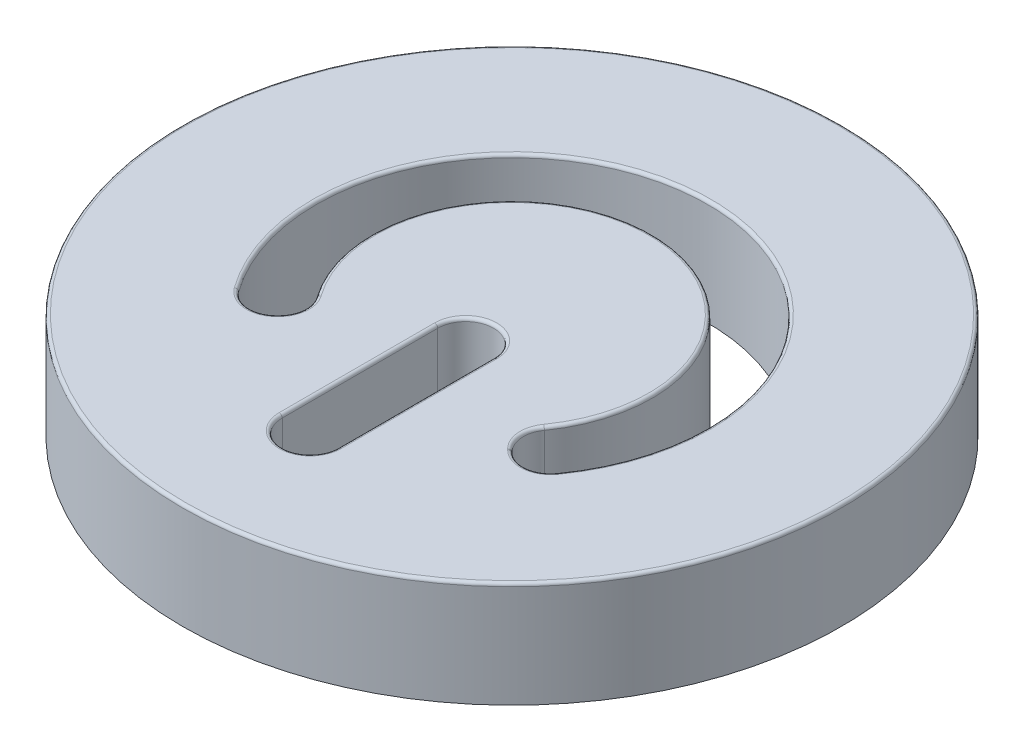
ISO-10303-21;
HEADER;
FILE_DESCRIPTION(('STEP AP214'),'2;1');
FILE_NAME('part.step','',(''),(''),'','','');
FILE_SCHEMA(('AUTOMOTIVE_DESIGN { 1 0 10303 214 1 1 1 1 }'));
ENDSEC;
DATA;
#1=APPLICATION_CONTEXT('core data for automotive mechanical design processes');
#2=APPLICATION_PROTOCOL_DEFINITION('international standard','automotive_design',2000,#1);
#3=PRODUCT_CONTEXT('',#1,'mechanical');
#4=PRODUCT('Part','Part','',(#3));
#5=PRODUCT_RELATED_PRODUCT_CATEGORY('part','',(#4));
#6=PRODUCT_DEFINITION_FORMATION('','',#4);
#7=PRODUCT_DEFINITION_CONTEXT('part definition',#1,'design');
#8=PRODUCT_DEFINITION('design','',#6,#7);
#9=PRODUCT_DEFINITION_SHAPE('','',#8);
#10=(LENGTH_UNIT() NAMED_UNIT(*) SI_UNIT(.MILLI.,.METRE.));
#11=(NAMED_UNIT(*) PLANE_ANGLE_UNIT() SI_UNIT($,.RADIAN.));
#12=(NAMED_UNIT(*) SI_UNIT($,.STERADIAN.) SOLID_ANGLE_UNIT());
#13=UNCERTAINTY_MEASURE_WITH_UNIT(LENGTH_MEASURE(1.E-05),#10,'distance_accuracy_value','');
#14=(GEOMETRIC_REPRESENTATION_CONTEXT(3) GLOBAL_UNCERTAINTY_ASSIGNED_CONTEXT((#13)) GLOBAL_UNIT_ASSIGNED_CONTEXT((#10,
#11,#12)) REPRESENTATION_CONTEXT('',''));
#15=CARTESIAN_POINT('',(0.,0.,0.));
#16=DIRECTION('',(0.,0.,1.));
#17=DIRECTION('',(1.,0.,0.));
#18=AXIS2_PLACEMENT_3D('',#15,#16,#17);
#19=CARTESIAN_POINT('',(2.20196013342093,1.65,1.57970616597673));
#20=DIRECTION('',(0.,1.,0.));
#21=DIRECTION('',(0.,0.,1.));
#22=AXIS2_PLACEMENT_3D('',#19,#20,#21);
#23=TOROIDAL_SURFACE('',#22,0.490000000000001,0.05);
#24=CARTESIAN_POINT('',(2.20196013342093,1.7,1.57970616597673));
#25=DIRECTION('',(0.,-1.,0.));
#26=DIRECTION('',(0.,0.,1.));
#27=AXIS2_PLACEMENT_3D('',#24,#25,#26);
#28=CIRCLE('',#27,0.490000000000001);
#29=CARTESIAN_POINT('',(2.6001005265487,1.7,1.86533569414227));
#30=VERTEX_POINT('',#29);
#31=CARTESIAN_POINT('',(1.85547781063952,1.7,1.92618848875814));
#32=VERTEX_POINT('',#31);
#33=EDGE_CURVE('E316',#30,#32,#28,.T.);
#34=ORIENTED_EDGE('',*,*,#33,.F.);
#35=CARTESIAN_POINT('',(2.6001005265487,1.65,1.86533569414227));
#36=DIRECTION('',(-0.582917404419459,0.,0.812531414546466));
#37=DIRECTION('',(0.812531414546466,0.,0.582917404419459));
#38=AXIS2_PLACEMENT_3D('',#35,#36,#37);
#39=CIRCLE('',#38,0.0499999999999999);
#40=CARTESIAN_POINT('',(2.55947395582137,1.65,1.83618982392129));
#41=VERTEX_POINT('',#40);
#42=EDGE_CURVE('E177',#30,#41,#39,.T.);
#43=ORIENTED_EDGE('',*,*,#42,.T.);
#44=CARTESIAN_POINT('',(2.20196013342093,1.65,1.57970616597673));
#45=DIRECTION('',(0.,1.,0.));
#46=DIRECTION('',(0.,0.,1.));
#47=AXIS2_PLACEMENT_3D('',#44,#45,#46);
#48=CIRCLE('',#47,0.440000000000001);
#49=CARTESIAN_POINT('',(1.89083314969885,1.65,1.89083314969881));
#50=VERTEX_POINT('',#49);
#51=EDGE_CURVE('E333',#50,#41,#48,.T.);
#52=ORIENTED_EDGE('',*,*,#51,.F.);
#53=CARTESIAN_POINT('',(1.85547781063952,1.65,1.92618848875814));
#54=DIRECTION('',(-0.707106781186552,0.,-0.707106781186543));
#55=DIRECTION('',(-0.707106781186543,0.,0.707106781186552));
#56=AXIS2_PLACEMENT_3D('',#53,#54,#55);
#57=CIRCLE('',#56,0.0500000000000001);
#58=EDGE_CURVE('E36',#32,#50,#57,.T.);
#59=ORIENTED_EDGE('',*,*,#58,.F.);
#60=EDGE_LOOP('',(#34,#43,#52,#59));
#61=FACE_BOUND('',#60,.T.);
#62=ADVANCED_FACE('F17',(#61),#23,.T.);
#63=CARTESIAN_POINT('',(-2.2019601334209,1.65,1.57970616597677));
#64=DIRECTION('',(0.,1.,0.));
#65=DIRECTION('',(0.,0.,1.));
#66=AXIS2_PLACEMENT_3D('',#63,#64,#65);
#67=TOROIDAL_SURFACE('',#66,0.49,0.05);
#68=CARTESIAN_POINT('',(-2.2019601334209,1.7,1.57970616597677));
#69=DIRECTION('',(0.,-1.,0.));
#70=DIRECTION('',(0.,0.,1.));
#71=AXIS2_PLACEMENT_3D('',#68,#69,#70);
#72=CIRCLE('',#71,0.49);
#73=CARTESIAN_POINT('',(-1.85547781063949,1.7,1.92618848875817));
#74=VERTEX_POINT('',#73);
#75=CARTESIAN_POINT('',(-2.60010052654866,1.7,1.86533569414231));
#76=VERTEX_POINT('',#75);
#77=EDGE_CURVE('E312',#74,#76,#72,.T.);
#78=ORIENTED_EDGE('',*,*,#77,.F.);
#79=CARTESIAN_POINT('',(-1.85547781063949,1.65,1.92618848875817));
#80=DIRECTION('',(0.707106781186541,0.,-0.707106781186554));
#81=DIRECTION('',(-0.707106781186554,0.,-0.707106781186541));
#82=AXIS2_PLACEMENT_3D('',#79,#80,#81);
#83=CIRCLE('',#82,0.0499999999999999);
#84=CARTESIAN_POINT('',(-1.89083314969881,1.65,1.89083314969885));
#85=VERTEX_POINT('',#84);
#86=EDGE_CURVE('E181',#85,#74,#83,.T.);
#87=ORIENTED_EDGE('',*,*,#86,.F.);
#88=CARTESIAN_POINT('',(-2.2019601334209,1.65,1.57970616597677));
#89=DIRECTION('',(0.,1.,0.));
#90=DIRECTION('',(0.,0.,1.));
#91=AXIS2_PLACEMENT_3D('',#88,#89,#90);
#92=CIRCLE('',#91,0.44);
#93=CARTESIAN_POINT('',(-2.55947395582134,1.65,1.83618982392134));
#94=VERTEX_POINT('',#93);
#95=EDGE_CURVE('E271',#94,#85,#92,.T.);
#96=ORIENTED_EDGE('',*,*,#95,.F.);
#97=CARTESIAN_POINT('',(-2.60010052654866,1.65,1.86533569414231));
#98=DIRECTION('',(0.582917404419472,0.,0.812531414546457));
#99=DIRECTION('',(0.812531414546457,0.,-0.582917404419472));
#100=AXIS2_PLACEMENT_3D('',#97,#98,#99);
#101=CIRCLE('',#100,0.05);
#102=EDGE_CURVE('E11',#94,#76,#101,.T.);
#103=ORIENTED_EDGE('',*,*,#102,.T.);
#104=EDGE_LOOP('',(#78,#87,#96,#103));
#105=FACE_BOUND('',#104,.T.);
#106=ADVANCED_FACE('F372',(#105),#67,.T.);
#107=CARTESIAN_POINT('',(0.,1.65,0.));
#108=DIRECTION('',(0.,1.,0.));
#109=DIRECTION('',(0.,0.,1.));
#110=AXIS2_PLACEMENT_3D('',#107,#108,#109);
#111=TOROIDAL_SURFACE('',#110,5.25,0.05);
#112=CARTESIAN_POINT('',(0.,1.7,0.));
#113=DIRECTION('',(0.,1.,0.));
#114=DIRECTION('',(0.,0.,1.));
#115=AXIS2_PLACEMENT_3D('',#112,#113,#114);
#116=CIRCLE('',#115,5.25);
#117=CARTESIAN_POINT('',(0.,1.7,5.25));
#118=VERTEX_POINT('',#117);
#119=EDGE_CURVE('E303',#118,#118,#116,.T.);
#120=ORIENTED_EDGE('',*,*,#119,.F.);
#121=EDGE_LOOP('',(#120));
#122=FACE_BOUND('',#121,.T.);
#123=CARTESIAN_POINT('',(0.,1.65,0.));
#124=DIRECTION('',(0.,-1.,0.));
#125=DIRECTION('',(0.,0.,1.));
#126=AXIS2_PLACEMENT_3D('',#123,#124,#125);
#127=CIRCLE('',#126,5.3);
#128=CARTESIAN_POINT('',(0.,1.65,5.3));
#129=VERTEX_POINT('',#128);
#130=EDGE_CURVE('E252',#129,#129,#127,.T.);
#131=ORIENTED_EDGE('',*,*,#130,.F.);
#132=EDGE_LOOP('',(#131));
#133=FACE_BOUND('',#132,.T.);
#134=ADVANCED_FACE('F378',(#122,#133),#111,.T.);
#135=CARTESIAN_POINT('',(0.,1.65,3.24458348950111));
#136=DIRECTION('',(0.,1.,0.));
#137=DIRECTION('',(0.,0.,1.));
#138=AXIS2_PLACEMENT_3D('',#135,#136,#137);
#139=TOROIDAL_SURFACE('',#138,0.5,0.05);
#140=CARTESIAN_POINT('',(0.,1.7,3.24458348950111));
#141=DIRECTION('',(0.,-1.,0.));
#142=DIRECTION('',(0.,0.,1.));
#143=AXIS2_PLACEMENT_3D('',#140,#141,#142);
#144=CIRCLE('',#143,0.5);
#145=CARTESIAN_POINT('',(0.5,1.7,3.24458348950111));
#146=VERTEX_POINT('',#145);
#147=CARTESIAN_POINT('',(-0.5,1.7,3.24458348950111));
#148=VERTEX_POINT('',#147);
#149=EDGE_CURVE('E301',#146,#148,#144,.T.);
#150=ORIENTED_EDGE('',*,*,#149,.F.);
#151=CARTESIAN_POINT('',(0.5,1.65,3.24458348950111));
#152=DIRECTION('',(0.,0.,-1.));
#153=DIRECTION('',(-1.,0.,0.));
#154=AXIS2_PLACEMENT_3D('',#151,#152,#153);
#155=CIRCLE('',#154,0.05);
#156=CARTESIAN_POINT('',(0.45,1.65,3.24458348950111));
#157=VERTEX_POINT('',#156);
#158=EDGE_CURVE('E176',#157,#146,#155,.T.);
#159=ORIENTED_EDGE('',*,*,#158,.F.);
#160=CARTESIAN_POINT('',(0.,1.65,3.24458348950111));
#161=DIRECTION('',(0.,1.,0.));
#162=DIRECTION('',(0.,0.,1.));
#163=AXIS2_PLACEMENT_3D('',#160,#161,#162);
#164=CIRCLE('',#163,0.45);
#165=CARTESIAN_POINT('',(-0.45,1.65,3.24458348950111));
#166=VERTEX_POINT('',#165);
#167=EDGE_CURVE('E233',#166,#157,#164,.T.);
#168=ORIENTED_EDGE('',*,*,#167,.F.);
#169=CARTESIAN_POINT('',(-0.5,1.65,3.24458348950111));
#170=DIRECTION('',(0.,0.,1.));
#171=DIRECTION('',(1.,0.,0.));
#172=AXIS2_PLACEMENT_3D('',#169,#170,#171);
#173=CIRCLE('',#172,0.05);
#174=EDGE_CURVE('E27',#166,#148,#173,.T.);
#175=ORIENTED_EDGE('',*,*,#174,.T.);
#176=EDGE_LOOP('',(#150,#159,#168,#175));
#177=FACE_BOUND('',#176,.T.);
#178=ADVANCED_FACE('F350',(#177),#139,.T.);
#179=CARTESIAN_POINT('',(0.,0.,3.24458348950111));
#180=DIRECTION('',(0.,1.,0.));
#181=DIRECTION('',(0.,0.,1.));
#182=AXIS2_PLACEMENT_3D('',#179,#180,#181);
#183=CYLINDRICAL_SURFACE('',#182,0.45);
#184=CARTESIAN_POINT('',(0.,0.,3.24458348950111));
#185=DIRECTION('',(0.,1.,0.));
#186=DIRECTION('',(0.,0.,1.));
#187=AXIS2_PLACEMENT_3D('',#184,#185,#186);
#188=CIRCLE('',#187,0.45);
#189=CARTESIAN_POINT('',(-0.45,0.,3.24458348950111));
#190=VERTEX_POINT('',#189);
#191=CARTESIAN_POINT('',(0.45,0.,3.24458348950111));
#192=VERTEX_POINT('',#191);
#193=EDGE_CURVE('E257',#190,#192,#188,.T.);
#194=ORIENTED_EDGE('',*,*,#193,.F.);
#195=DIRECTION('',(0.,1.,0.));
#196=VECTOR('',#195,1.);
#197=CARTESIAN_POINT('',(-0.45,0.,3.24458348950111));
#198=LINE('',#197,#196);
#199=EDGE_CURVE('E230',#190,#166,#198,.T.);
#200=ORIENTED_EDGE('',*,*,#199,.T.);
#201=ORIENTED_EDGE('',*,*,#167,.T.);
#202=DIRECTION('',(0.,1.,0.));
#203=VECTOR('',#202,1.);
#204=CARTESIAN_POINT('',(0.45,0.,3.24458348950111));
#205=LINE('',#204,#203);
#206=EDGE_CURVE('E152',#192,#157,#205,.T.);
#207=ORIENTED_EDGE('',*,*,#206,.F.);
#208=EDGE_LOOP('',(#194,#200,#201,#207));
#209=FACE_BOUND('',#208,.T.);
#210=ADVANCED_FACE('F352',(#209),#183,.F.);
#211=CARTESIAN_POINT('',(2.20196013342093,0.,1.57970616597673));
#212=DIRECTION('',(0.,1.,0.));
#213=DIRECTION('',(0.,0.,1.));
#214=AXIS2_PLACEMENT_3D('',#211,#212,#213);
#215=CYLINDRICAL_SURFACE('',#214,0.440000000000001);
#216=CARTESIAN_POINT('',(2.20196013342093,0.,1.57970616597673));
#217=DIRECTION('',(0.,1.,0.));
#218=DIRECTION('',(0.,0.,1.));
#219=AXIS2_PLACEMENT_3D('',#216,#217,#218);
#220=CIRCLE('',#219,0.440000000000001);
#221=CARTESIAN_POINT('',(1.89083314969885,0.,1.89083314969881));
#222=VERTEX_POINT('',#221);
#223=CARTESIAN_POINT('',(2.55947395582137,0.,1.83618982392129));
#224=VERTEX_POINT('',#223);
#225=EDGE_CURVE('E263',#222,#224,#220,.T.);
#226=ORIENTED_EDGE('',*,*,#225,.F.);
#227=DIRECTION('',(0.,1.,0.));
#228=VECTOR('',#227,1.);
#229=CARTESIAN_POINT('',(1.89083314969885,0.,1.89083314969881));
#230=LINE('',#229,#228);
#231=EDGE_CURVE('E331',#222,#50,#230,.T.);
#232=ORIENTED_EDGE('',*,*,#231,.T.);
#233=ORIENTED_EDGE('',*,*,#51,.T.);
#234=DIRECTION('',(0.,1.,0.));
#235=VECTOR('',#234,1.);
#236=CARTESIAN_POINT('',(2.55947395582137,0.,1.83618982392129));
#237=LINE('',#236,#235);
#238=EDGE_CURVE('E268',#224,#41,#237,.T.);
#239=ORIENTED_EDGE('',*,*,#238,.F.);
#240=EDGE_LOOP('',(#226,#232,#233,#239));
#241=FACE_BOUND('',#240,.T.);
#242=ADVANCED_FACE('F389',(#241),#215,.F.);
#243=CARTESIAN_POINT('',(-2.2019601334209,0.,1.57970616597677));
#244=DIRECTION('',(0.,1.,0.));
#245=DIRECTION('',(0.,0.,1.));
#246=AXIS2_PLACEMENT_3D('',#243,#244,#245);
#247=CYLINDRICAL_SURFACE('',#246,0.44);
#248=CARTESIAN_POINT('',(-2.2019601334209,0.,1.57970616597677));
#249=DIRECTION('',(0.,1.,0.));
#250=DIRECTION('',(0.,0.,1.));
#251=AXIS2_PLACEMENT_3D('',#248,#249,#250);
#252=CIRCLE('',#251,0.44);
#253=CARTESIAN_POINT('',(-2.55947395582134,0.,1.83618982392134));
#254=VERTEX_POINT('',#253);
#255=CARTESIAN_POINT('',(-1.89083314969881,0.,1.89083314969885));
#256=VERTEX_POINT('',#255);
#257=EDGE_CURVE('E273',#254,#256,#252,.T.);
#258=ORIENTED_EDGE('',*,*,#257,.F.);
#259=DIRECTION('',(0.,1.,0.));
#260=VECTOR('',#259,1.);
#261=CARTESIAN_POINT('',(-2.55947395582134,0.,1.83618982392134));
#262=LINE('',#261,#260);
#263=EDGE_CURVE('E326',#254,#94,#262,.T.);
#264=ORIENTED_EDGE('',*,*,#263,.T.);
#265=ORIENTED_EDGE('',*,*,#95,.T.);
#266=DIRECTION('',(0.,1.,0.));
#267=VECTOR('',#266,1.);
#268=CARTESIAN_POINT('',(-1.89083314969881,0.,1.89083314969885));
#269=LINE('',#268,#267);
#270=EDGE_CURVE('E276',#256,#85,#269,.T.);
#271=ORIENTED_EDGE('',*,*,#270,.F.);
#272=EDGE_LOOP('',(#258,#264,#265,#271));
#273=FACE_BOUND('',#272,.T.);
#274=ADVANCED_FACE('F366',(#273),#247,.F.);
#275=CARTESIAN_POINT('',(0.,0.,0.));
#276=DIRECTION('',(0.,1.,0.));
#277=DIRECTION('',(0.,0.,1.));
#278=AXIS2_PLACEMENT_3D('',#275,#276,#277);
#279=CYLINDRICAL_SURFACE('',#278,5.3);
#280=ORIENTED_EDGE('',*,*,#130,.T.);
#281=EDGE_LOOP('',(#280));
#282=FACE_BOUND('',#281,.T.);
#283=CARTESIAN_POINT('',(0.,0.,0.));
#284=DIRECTION('',(0.,1.,0.));
#285=DIRECTION('',(0.,0.,1.));
#286=AXIS2_PLACEMENT_3D('',#283,#284,#285);
#287=CIRCLE('',#286,5.3);
#288=CARTESIAN_POINT('',(0.,0.,5.3));
#289=VERTEX_POINT('',#288);
#290=EDGE_CURVE('E249',#289,#289,#287,.T.);
#291=ORIENTED_EDGE('',*,*,#290,.T.);
#292=EDGE_LOOP('',(#291));
#293=FACE_BOUND('',#292,.T.);
#294=ADVANCED_FACE('F356',(#282,#293),#279,.T.);
#295=CARTESIAN_POINT('',(0.,0.,0.));
#296=DIRECTION('',(0.,1.,0.));
#297=DIRECTION('',(0.,0.,1.));
#298=AXIS2_PLACEMENT_3D('',#295,#296,#297);
#299=PLANE('',#298);
#300=ORIENTED_EDGE('',*,*,#290,.F.);
#301=EDGE_LOOP('',(#300));
#302=FACE_BOUND('',#301,.T.);
#303=DIRECTION('',(0.707106781186542,0.,-0.707106781186553));
#304=VECTOR('',#303,1.);
#305=CARTESIAN_POINT('',(-1.8764994004795,0.,1.87649940047954));
#306=LINE('',#305,#304);
#307=CARTESIAN_POINT('',(-1.8764994004795,0.,1.87649940047954));
#308=VERTEX_POINT('',#307);
#309=EDGE_CURVE('E281',#256,#308,#306,.T.);
#310=ORIENTED_EDGE('',*,*,#309,.T.);
#311=CARTESIAN_POINT('',(-2.18762638420159,0.,1.56537241675746));
#312=DIRECTION('',(0.,1.,0.));
#313=DIRECTION('',(0.,0.,1.));
#314=AXIS2_PLACEMENT_3D('',#311,#312,#313);
#315=CIRCLE('',#314,0.44);
#316=CARTESIAN_POINT('',(-1.82979902024296,0.,1.30932637089378));
#317=VERTEX_POINT('',#316);
#318=EDGE_CURVE('E284',#308,#317,#315,.T.);
#319=ORIENTED_EDGE('',*,*,#318,.T.);
#320=CARTESIAN_POINT('',(0.,0.,0.));
#321=DIRECTION('',(0.,-1.,0.));
#322=DIRECTION('',(0.,0.,1.));
#323=AXIS2_PLACEMENT_3D('',#320,#321,#322);
#324=CIRCLE('',#323,2.25);
#325=CARTESIAN_POINT('',(1.82979902024299,0.,1.30932637089375));
#326=VERTEX_POINT('',#325);
#327=EDGE_CURVE('E287',#317,#326,#324,.T.);
#328=ORIENTED_EDGE('',*,*,#327,.T.);
#329=CARTESIAN_POINT('',(2.18762638420161,0.,1.56537241675742));
#330=DIRECTION('',(0.,1.,0.));
#331=DIRECTION('',(0.,0.,-1.));
#332=AXIS2_PLACEMENT_3D('',#329,#330,#331);
#333=CIRCLE('',#332,0.44);
#334=CARTESIAN_POINT('',(1.87649940047954,0.,1.8764994004795));
#335=VERTEX_POINT('',#334);
#336=EDGE_CURVE('E219',#326,#335,#333,.T.);
#337=ORIENTED_EDGE('',*,*,#336,.T.);
#338=DIRECTION('',(0.707106781186553,0.,0.707106781186542));
#339=VECTOR('',#338,1.);
#340=CARTESIAN_POINT('',(1.87649940047954,0.,1.8764994004795));
#341=LINE('',#340,#339);
#342=EDGE_CURVE('E266',#335,#222,#341,.T.);
#343=ORIENTED_EDGE('',*,*,#342,.T.);
#344=ORIENTED_EDGE('',*,*,#225,.T.);
#345=CARTESIAN_POINT('',(0.,0.,0.));
#346=DIRECTION('',(0.,1.,0.));
#347=DIRECTION('',(0.,0.,1.));
#348=AXIS2_PLACEMENT_3D('',#345,#346,#347);
#349=CIRCLE('',#348,3.15);
#350=EDGE_CURVE('E267',#224,#254,#349,.T.);
#351=ORIENTED_EDGE('',*,*,#350,.T.);
#352=ORIENTED_EDGE('',*,*,#257,.T.);
#353=EDGE_LOOP('',(#310,#319,#328,#337,#343,#344,#351,#352));
#354=FACE_BOUND('',#353,.T.);
#355=DIRECTION('',(0.,0.,1.));
#356=VECTOR('',#355,1.);
#357=CARTESIAN_POINT('',(-0.45,0.,3.24458348950111));
#358=LINE('',#357,#356);
#359=CARTESIAN_POINT('',(-0.45,0.,0.744583489501109));
#360=VERTEX_POINT('',#359);
#361=EDGE_CURVE('E260',#360,#190,#358,.T.);
#362=ORIENTED_EDGE('',*,*,#361,.T.);
#363=ORIENTED_EDGE('',*,*,#193,.T.);
#364=DIRECTION('',(0.,0.,-1.));
#365=VECTOR('',#364,1.);
#366=CARTESIAN_POINT('',(0.45,0.,3.24458348950111));
#367=LINE('',#366,#365);
#368=CARTESIAN_POINT('',(0.45,0.,0.744583489501109));
#369=VERTEX_POINT('',#368);
#370=EDGE_CURVE('E261',#192,#369,#367,.T.);
#371=ORIENTED_EDGE('',*,*,#370,.T.);
#372=CARTESIAN_POINT('',(0.,0.,0.744583489501109));
#373=DIRECTION('',(0.,1.,0.));
#374=DIRECTION('',(0.,0.,1.));
#375=AXIS2_PLACEMENT_3D('',#372,#373,#374);
#376=CIRCLE('',#375,0.45);
#377=EDGE_CURVE('E168',#369,#360,#376,.T.);
#378=ORIENTED_EDGE('',*,*,#377,.T.);
#379=EDGE_LOOP('',(#362,#363,#371,#378));
#380=FACE_BOUND('',#379,.T.);
#381=ADVANCED_FACE('F354',(#302,#354,#380),#299,.F.);
#382=CARTESIAN_POINT('',(0.,1.7,0.));
#383=DIRECTION('',(0.,1.,0.));
#384=DIRECTION('',(0.,0.,1.));
#385=AXIS2_PLACEMENT_3D('',#382,#383,#384);
#386=PLANE('',#385);
#387=CARTESIAN_POINT('',(0.,1.7,0.744583489501109));
#388=DIRECTION('',(0.,-1.,0.));
#389=DIRECTION('',(0.,0.,1.));
#390=AXIS2_PLACEMENT_3D('',#387,#388,#389);
#391=CIRCLE('',#390,0.5);
#392=CARTESIAN_POINT('',(-0.5,1.7,0.744583489501109));
#393=VERTEX_POINT('',#392);
#394=CARTESIAN_POINT('',(0.5,1.7,0.744583489501109));
#395=VERTEX_POINT('',#394);
#396=EDGE_CURVE('E298',#393,#395,#391,.T.);
#397=ORIENTED_EDGE('',*,*,#396,.T.);
#398=DIRECTION('',(0.,0.,1.));
#399=VECTOR('',#398,1.);
#400=CARTESIAN_POINT('',(0.5,1.7,3.24458348950111));
#401=LINE('',#400,#399);
#402=EDGE_CURVE('E174',#395,#146,#401,.T.);
#403=ORIENTED_EDGE('',*,*,#402,.T.);
#404=ORIENTED_EDGE('',*,*,#149,.T.);
#405=DIRECTION('',(0.,0.,-1.));
#406=VECTOR('',#405,1.);
#407=CARTESIAN_POINT('',(-0.5,1.7,0.744583489501109));
#408=LINE('',#407,#406);
#409=EDGE_CURVE('E247',#148,#393,#408,.T.);
#410=ORIENTED_EDGE('',*,*,#409,.T.);
#411=EDGE_LOOP('',(#397,#403,#404,#410));
#412=FACE_BOUND('',#411,.T.);
#413=ORIENTED_EDGE('',*,*,#119,.T.);
#414=EDGE_LOOP('',(#413));
#415=FACE_BOUND('',#414,.T.);
#416=CARTESIAN_POINT('',(2.18762638420161,1.7,1.56537241675742));
#417=DIRECTION('',(0.,-1.,0.));
#418=DIRECTION('',(0.,0.,1.));
#419=AXIS2_PLACEMENT_3D('',#416,#417,#418);
#420=CIRCLE('',#419,0.49);
#421=CARTESIAN_POINT('',(1.84114406142021,1.7,1.91185473953883));
#422=VERTEX_POINT('',#421);
#423=CARTESIAN_POINT('',(1.78913681979314,1.7,1.28023022931834));
#424=VERTEX_POINT('',#423);
#425=EDGE_CURVE('E207',#422,#424,#420,.T.);
#426=ORIENTED_EDGE('',*,*,#425,.T.);
#427=CARTESIAN_POINT('',(0.,1.7,0.));
#428=DIRECTION('',(0.,1.,0.));
#429=DIRECTION('',(0.,0.,1.));
#430=AXIS2_PLACEMENT_3D('',#427,#428,#429);
#431=CIRCLE('',#430,2.2);
#432=CARTESIAN_POINT('',(-1.78913681979312,1.7,1.28023022931837));
#433=VERTEX_POINT('',#432);
#434=EDGE_CURVE('E201',#424,#433,#431,.T.);
#435=ORIENTED_EDGE('',*,*,#434,.T.);
#436=CARTESIAN_POINT('',(-2.18762638420159,1.7,1.56537241675746));
#437=DIRECTION('',(0.,-1.,0.));
#438=DIRECTION('',(0.,0.,1.));
#439=AXIS2_PLACEMENT_3D('',#436,#437,#438);
#440=CIRCLE('',#439,0.49);
#441=CARTESIAN_POINT('',(-1.84114406142018,1.7,1.91185473953886));
#442=VERTEX_POINT('',#441);
#443=EDGE_CURVE('E306',#433,#442,#440,.T.);
#444=ORIENTED_EDGE('',*,*,#443,.T.);
#445=DIRECTION('',(-0.707106781186542,0.,0.707106781186553));
#446=VECTOR('',#445,1.);
#447=CARTESIAN_POINT('',(-1.85547781063949,1.7,1.92618848875817));
#448=LINE('',#447,#446);
#449=EDGE_CURVE('E309',#442,#74,#448,.T.);
#450=ORIENTED_EDGE('',*,*,#449,.T.);
#451=ORIENTED_EDGE('',*,*,#77,.T.);
#452=CARTESIAN_POINT('',(0.,1.7,0.));
#453=DIRECTION('',(0.,-1.,0.));
#454=DIRECTION('',(0.,0.,1.));
#455=AXIS2_PLACEMENT_3D('',#452,#453,#454);
#456=CIRCLE('',#455,3.2);
#457=EDGE_CURVE('E313',#76,#30,#456,.T.);
#458=ORIENTED_EDGE('',*,*,#457,.T.);
#459=ORIENTED_EDGE('',*,*,#33,.T.);
#460=DIRECTION('',(-0.707106781186553,0.,-0.707106781186542));
#461=VECTOR('',#460,1.);
#462=CARTESIAN_POINT('',(1.84114406142021,1.7,1.91185473953883));
#463=LINE('',#462,#461);
#464=EDGE_CURVE('E317',#32,#422,#463,.T.);
#465=ORIENTED_EDGE('',*,*,#464,.T.);
#466=EDGE_LOOP('',(#426,#435,#444,#450,#451,#458,#459,#465));
#467=FACE_BOUND('',#466,.T.);
#468=ADVANCED_FACE('F348',(#412,#415,#467),#386,.T.);
#469=CARTESIAN_POINT('',(-2.18762638420159,0.,1.56537241675746));
#470=DIRECTION('',(0.,1.,0.));
#471=DIRECTION('',(0.,0.,1.));
#472=AXIS2_PLACEMENT_3D('',#469,#470,#471);
#473=CYLINDRICAL_SURFACE('',#472,0.44);
#474=DIRECTION('',(0.,1.,0.));
#475=VECTOR('',#474,1.);
#476=CARTESIAN_POINT('',(-1.8764994004795,0.,1.87649940047954));
#477=LINE('',#476,#475);
#478=CARTESIAN_POINT('',(-1.8764994004795,1.65,1.87649940047954));
#479=VERTEX_POINT('',#478);
#480=EDGE_CURVE('E319',#308,#479,#477,.T.);
#481=ORIENTED_EDGE('',*,*,#480,.T.);
#482=CARTESIAN_POINT('',(-2.18762638420159,1.65,1.56537241675746));
#483=DIRECTION('',(0.,1.,0.));
#484=DIRECTION('',(0.,0.,1.));
#485=AXIS2_PLACEMENT_3D('',#482,#483,#484);
#486=CIRCLE('',#485,0.44);
#487=CARTESIAN_POINT('',(-1.82979902024296,1.65,1.30932637089378));
#488=VERTEX_POINT('',#487);
#489=EDGE_CURVE('E278',#479,#488,#486,.T.);
#490=ORIENTED_EDGE('',*,*,#489,.T.);
#491=DIRECTION('',(0.,1.,0.));
#492=VECTOR('',#491,1.);
#493=CARTESIAN_POINT('',(-1.82979902024296,0.,1.30932637089378));
#494=LINE('',#493,#492);
#495=EDGE_CURVE('E214',#317,#488,#494,.T.);
#496=ORIENTED_EDGE('',*,*,#495,.F.);
#497=ORIENTED_EDGE('',*,*,#318,.F.);
#498=EDGE_LOOP('',(#481,#490,#496,#497));
#499=FACE_BOUND('',#498,.T.);
#500=ADVANCED_FACE('F364',(#499),#473,.F.);
#501=CARTESIAN_POINT('',(-1.8764994004795,0.,1.87649940047954));
#502=DIRECTION('',(0.707106781186553,0.,0.707106781186542));
#503=DIRECTION('',(0.707106781186542,0.,-0.707106781186553));
#504=AXIS2_PLACEMENT_3D('',#501,#502,#503);
#505=PLANE('',#504);
#506=ORIENTED_EDGE('',*,*,#270,.T.);
#507=DIRECTION('',(0.707106781186542,0.,-0.707106781186553));
#508=VECTOR('',#507,1.);
#509=CARTESIAN_POINT('',(-1.8764994004795,1.65,1.87649940047954));
#510=LINE('',#509,#508);
#511=EDGE_CURVE('E279',#85,#479,#510,.T.);
#512=ORIENTED_EDGE('',*,*,#511,.T.);
#513=ORIENTED_EDGE('',*,*,#480,.F.);
#514=ORIENTED_EDGE('',*,*,#309,.F.);
#515=EDGE_LOOP('',(#506,#512,#513,#514));
#516=FACE_BOUND('',#515,.T.);
#517=ADVANCED_FACE('F414',(#516),#505,.F.);
#518=CARTESIAN_POINT('',(0.,0.,0.));
#519=DIRECTION('',(0.,1.,0.));
#520=DIRECTION('',(0.,0.,1.));
#521=AXIS2_PLACEMENT_3D('',#518,#519,#520);
#522=CYLINDRICAL_SURFACE('',#521,3.15);
#523=ORIENTED_EDGE('',*,*,#238,.T.);
#524=CARTESIAN_POINT('',(0.,1.65,0.));
#525=DIRECTION('',(0.,1.,0.));
#526=DIRECTION('',(0.,0.,1.));
#527=AXIS2_PLACEMENT_3D('',#524,#525,#526);
#528=CIRCLE('',#527,3.15);
#529=EDGE_CURVE('E272',#41,#94,#528,.T.);
#530=ORIENTED_EDGE('',*,*,#529,.T.);
#531=ORIENTED_EDGE('',*,*,#263,.F.);
#532=ORIENTED_EDGE('',*,*,#350,.F.);
#533=EDGE_LOOP('',(#523,#530,#531,#532));
#534=FACE_BOUND('',#533,.T.);
#535=ADVANCED_FACE('F401',(#534),#522,.F.);
#536=CARTESIAN_POINT('',(1.87649940047954,0.,1.8764994004795));
#537=DIRECTION('',(-0.707106781186542,0.,0.707106781186553));
#538=DIRECTION('',(0.707106781186553,0.,0.707106781186542));
#539=AXIS2_PLACEMENT_3D('',#536,#537,#538);
#540=PLANE('',#539);
#541=DIRECTION('',(0.,1.,0.));
#542=VECTOR('',#541,1.);
#543=CARTESIAN_POINT('',(1.87649940047954,0.,1.8764994004795));
#544=LINE('',#543,#542);
#545=CARTESIAN_POINT('',(1.87649940047954,1.65,1.8764994004795));
#546=VERTEX_POINT('',#545);
#547=EDGE_CURVE('E225',#335,#546,#544,.T.);
#548=ORIENTED_EDGE('',*,*,#547,.T.);
#549=DIRECTION('',(0.707106781186553,0.,0.707106781186542));
#550=VECTOR('',#549,1.);
#551=CARTESIAN_POINT('',(1.89083314969885,1.65,1.89083314969881));
#552=LINE('',#551,#550);
#553=EDGE_CURVE('E222',#546,#50,#552,.T.);
#554=ORIENTED_EDGE('',*,*,#553,.T.);
#555=ORIENTED_EDGE('',*,*,#231,.F.);
#556=ORIENTED_EDGE('',*,*,#342,.F.);
#557=EDGE_LOOP('',(#548,#554,#555,#556));
#558=FACE_BOUND('',#557,.T.);
#559=ADVANCED_FACE('F425',(#558),#540,.F.);
#560=CARTESIAN_POINT('',(2.18762638420161,0.,1.56537241675742));
#561=DIRECTION('',(0.,1.,0.));
#562=DIRECTION('',(0.,0.,1.));
#563=AXIS2_PLACEMENT_3D('',#560,#561,#562);
#564=CYLINDRICAL_SURFACE('',#563,0.44);
#565=DIRECTION('',(0.,1.,0.));
#566=VECTOR('',#565,1.);
#567=CARTESIAN_POINT('',(1.82979902024299,0.,1.30932637089375));
#568=LINE('',#567,#566);
#569=CARTESIAN_POINT('',(1.82979902024299,1.65,1.30932637089375));
#570=VERTEX_POINT('',#569);
#571=EDGE_CURVE('E213',#326,#570,#568,.T.);
#572=ORIENTED_EDGE('',*,*,#571,.T.);
#573=CARTESIAN_POINT('',(2.18762638420161,1.65,1.56537241675742));
#574=DIRECTION('',(0.,1.,0.));
#575=DIRECTION('',(0.,0.,1.));
#576=AXIS2_PLACEMENT_3D('',#573,#574,#575);
#577=CIRCLE('',#576,0.44);
#578=EDGE_CURVE('E209',#570,#546,#577,.T.);
#579=ORIENTED_EDGE('',*,*,#578,.T.);
#580=ORIENTED_EDGE('',*,*,#547,.F.);
#581=ORIENTED_EDGE('',*,*,#336,.F.);
#582=EDGE_LOOP('',(#572,#579,#580,#581));
#583=FACE_BOUND('',#582,.T.);
#584=ADVANCED_FACE('F217',(#583),#564,.F.);
#585=CARTESIAN_POINT('',(0.,0.,0.));
#586=DIRECTION('',(0.,1.,0.));
#587=DIRECTION('',(0.,0.,1.));
#588=AXIS2_PLACEMENT_3D('',#585,#586,#587);
#589=CYLINDRICAL_SURFACE('',#588,2.25);
#590=ORIENTED_EDGE('',*,*,#495,.T.);
#591=CARTESIAN_POINT('',(0.,1.65,0.));
#592=DIRECTION('',(0.,-1.,0.));
#593=DIRECTION('',(0.,0.,1.));
#594=AXIS2_PLACEMENT_3D('',#591,#592,#593);
#595=CIRCLE('',#594,2.25);
#596=EDGE_CURVE('E198',#488,#570,#595,.T.);
#597=ORIENTED_EDGE('',*,*,#596,.T.);
#598=ORIENTED_EDGE('',*,*,#571,.F.);
#599=ORIENTED_EDGE('',*,*,#327,.F.);
#600=EDGE_LOOP('',(#590,#597,#598,#599));
#601=FACE_BOUND('',#600,.T.);
#602=ADVANCED_FACE('F417',(#601),#589,.T.);
#603=CARTESIAN_POINT('',(-0.45,0.,3.24458348950111));
#604=DIRECTION('',(-1.,0.,0.));
#605=DIRECTION('',(0.,0.,1.));
#606=AXIS2_PLACEMENT_3D('',#603,#604,#605);
#607=PLANE('',#606);
#608=DIRECTION('',(0.,1.,0.));
#609=VECTOR('',#608,1.);
#610=CARTESIAN_POINT('',(-0.45,0.,0.744583489501109));
#611=LINE('',#610,#609);
#612=CARTESIAN_POINT('',(-0.45,1.65,0.744583489501109));
#613=VERTEX_POINT('',#612);
#614=EDGE_CURVE('E234',#360,#613,#611,.T.);
#615=ORIENTED_EDGE('',*,*,#614,.T.);
#616=DIRECTION('',(0.,0.,1.));
#617=VECTOR('',#616,1.);
#618=CARTESIAN_POINT('',(-0.45,1.65,3.24458348950111));
#619=LINE('',#618,#617);
#620=EDGE_CURVE('E170',#613,#166,#619,.T.);
#621=ORIENTED_EDGE('',*,*,#620,.T.);
#622=ORIENTED_EDGE('',*,*,#199,.F.);
#623=ORIENTED_EDGE('',*,*,#361,.F.);
#624=EDGE_LOOP('',(#615,#621,#622,#623));
#625=FACE_BOUND('',#624,.T.);
#626=ADVANCED_FACE('F240',(#625),#607,.F.);
#627=CARTESIAN_POINT('',(0.,0.,0.744583489501109));
#628=DIRECTION('',(0.,1.,0.));
#629=DIRECTION('',(0.,0.,1.));
#630=AXIS2_PLACEMENT_3D('',#627,#628,#629);
#631=CYLINDRICAL_SURFACE('',#630,0.45);
#632=DIRECTION('',(0.,1.,0.));
#633=VECTOR('',#632,1.);
#634=CARTESIAN_POINT('',(0.45,0.,0.744583489501109));
#635=LINE('',#634,#633);
#636=CARTESIAN_POINT('',(0.45,1.65,0.744583489501109));
#637=VERTEX_POINT('',#636);
#638=EDGE_CURVE('E151',#369,#637,#635,.T.);
#639=ORIENTED_EDGE('',*,*,#638,.T.);
#640=CARTESIAN_POINT('',(0.,1.65,0.744583489501109));
#641=DIRECTION('',(0.,1.,0.));
#642=DIRECTION('',(0.,0.,1.));
#643=AXIS2_PLACEMENT_3D('',#640,#641,#642);
#644=CIRCLE('',#643,0.45);
#645=EDGE_CURVE('E141',#637,#613,#644,.T.);
#646=ORIENTED_EDGE('',*,*,#645,.T.);
#647=ORIENTED_EDGE('',*,*,#614,.F.);
#648=ORIENTED_EDGE('',*,*,#377,.F.);
#649=EDGE_LOOP('',(#639,#646,#647,#648));
#650=FACE_BOUND('',#649,.T.);
#651=ADVANCED_FACE('F167',(#650),#631,.F.);
#652=CARTESIAN_POINT('',(0.45,0.,3.24458348950111));
#653=DIRECTION('',(1.,0.,0.));
#654=DIRECTION('',(0.,0.,-1.));
#655=AXIS2_PLACEMENT_3D('',#652,#653,#654);
#656=PLANE('',#655);
#657=ORIENTED_EDGE('',*,*,#206,.T.);
#658=DIRECTION('',(0.,0.,-1.));
#659=VECTOR('',#658,1.);
#660=CARTESIAN_POINT('',(0.45,1.65,0.744583489501109));
#661=LINE('',#660,#659);
#662=EDGE_CURVE('E148',#157,#637,#661,.T.);
#663=ORIENTED_EDGE('',*,*,#662,.T.);
#664=ORIENTED_EDGE('',*,*,#638,.F.);
#665=ORIENTED_EDGE('',*,*,#370,.F.);
#666=EDGE_LOOP('',(#657,#663,#664,#665));
#667=FACE_BOUND('',#666,.T.);
#668=ADVANCED_FACE('F149',(#667),#656,.F.);
#669=CARTESIAN_POINT('',(-0.5,1.65,3.24458348950111));
#670=DIRECTION('',(0.,0.,-1.));
#671=DIRECTION('',(-1.,0.,0.));
#672=AXIS2_PLACEMENT_3D('',#669,#670,#671);
#673=CYLINDRICAL_SURFACE('',#672,0.05);
#674=CARTESIAN_POINT('',(-0.5,1.65,0.744583489501109));
#675=DIRECTION('',(0.,0.,-1.));
#676=DIRECTION('',(-1.,0.,0.));
#677=AXIS2_PLACEMENT_3D('',#674,#675,#676);
#678=CIRCLE('',#677,0.05);
#679=EDGE_CURVE('E157',#393,#613,#678,.T.);
#680=ORIENTED_EDGE('',*,*,#679,.F.);
#681=ORIENTED_EDGE('',*,*,#409,.F.);
#682=ORIENTED_EDGE('',*,*,#174,.F.);
#683=ORIENTED_EDGE('',*,*,#620,.F.);
#684=EDGE_LOOP('',(#680,#681,#682,#683));
#685=FACE_BOUND('',#684,.T.);
#686=ADVANCED_FACE('F244',(#685),#673,.T.);
#687=CARTESIAN_POINT('',(0.,1.65,0.744583489501109));
#688=DIRECTION('',(0.,1.,0.));
#689=DIRECTION('',(0.,0.,1.));
#690=AXIS2_PLACEMENT_3D('',#687,#688,#689);
#691=TOROIDAL_SURFACE('',#690,0.5,0.05);
#692=ORIENTED_EDGE('',*,*,#679,.T.);
#693=ORIENTED_EDGE('',*,*,#645,.F.);
#694=CARTESIAN_POINT('',(0.5,1.65,0.744583489501109));
#695=DIRECTION('',(0.,0.,1.));
#696=DIRECTION('',(1.,0.,0.));
#697=AXIS2_PLACEMENT_3D('',#694,#695,#696);
#698=CIRCLE('',#697,0.05);
#699=EDGE_CURVE('E164',#395,#637,#698,.T.);
#700=ORIENTED_EDGE('',*,*,#699,.F.);
#701=ORIENTED_EDGE('',*,*,#396,.F.);
#702=EDGE_LOOP('',(#692,#693,#700,#701));
#703=FACE_BOUND('',#702,.T.);
#704=ADVANCED_FACE('F162',(#703),#691,.T.);
#705=CARTESIAN_POINT('',(0.5,1.65,3.24458348950111));
#706=DIRECTION('',(0.,0.,1.));
#707=DIRECTION('',(1.,0.,0.));
#708=AXIS2_PLACEMENT_3D('',#705,#706,#707);
#709=CYLINDRICAL_SURFACE('',#708,0.05);
#710=ORIENTED_EDGE('',*,*,#158,.T.);
#711=ORIENTED_EDGE('',*,*,#402,.F.);
#712=ORIENTED_EDGE('',*,*,#699,.T.);
#713=ORIENTED_EDGE('',*,*,#662,.F.);
#714=EDGE_LOOP('',(#710,#711,#712,#713));
#715=FACE_BOUND('',#714,.T.);
#716=ADVANCED_FACE('F172',(#715),#709,.T.);
#717=CARTESIAN_POINT('',(0.,1.65,0.));
#718=DIRECTION('',(0.,1.,0.));
#719=DIRECTION('',(0.,0.,1.));
#720=AXIS2_PLACEMENT_3D('',#717,#718,#719);
#721=TOROIDAL_SURFACE('',#720,3.2,0.05);
#722=ORIENTED_EDGE('',*,*,#42,.F.);
#723=ORIENTED_EDGE('',*,*,#457,.F.);
#724=ORIENTED_EDGE('',*,*,#102,.F.);
#725=ORIENTED_EDGE('',*,*,#529,.F.);
#726=EDGE_LOOP('',(#722,#723,#724,#725));
#727=FACE_BOUND('',#726,.T.);
#728=ADVANCED_FACE('F404',(#727),#721,.T.);
#729=CARTESIAN_POINT('',(-1.84114406142018,1.65,1.91185473953886));
#730=DIRECTION('',(-0.707106781186542,0.,0.707106781186553));
#731=DIRECTION('',(0.707106781186553,0.,0.707106781186542));
#732=AXIS2_PLACEMENT_3D('',#729,#730,#731);
#733=CYLINDRICAL_SURFACE('',#732,0.0500000000000001);
#734=ORIENTED_EDGE('',*,*,#86,.T.);
#735=ORIENTED_EDGE('',*,*,#449,.F.);
#736=CARTESIAN_POINT('',(-1.84114406142018,1.65,1.91185473953886));
#737=DIRECTION('',(0.707106781186543,0.,-0.707106781186552));
#738=DIRECTION('',(-0.707106781186552,0.,-0.707106781186543));
#739=AXIS2_PLACEMENT_3D('',#736,#737,#738);
#740=CIRCLE('',#739,0.0500000000000001);
#741=EDGE_CURVE('E187',#479,#442,#740,.T.);
#742=ORIENTED_EDGE('',*,*,#741,.F.);
#743=ORIENTED_EDGE('',*,*,#511,.F.);
#744=EDGE_LOOP('',(#734,#735,#742,#743));
#745=FACE_BOUND('',#744,.T.);
#746=ADVANCED_FACE('F410',(#745),#733,.T.);
#747=CARTESIAN_POINT('',(1.84114406142021,1.65,1.91185473953883));
#748=DIRECTION('',(-0.707106781186553,0.,-0.707106781186542));
#749=DIRECTION('',(-0.707106781186542,0.,0.707106781186553));
#750=AXIS2_PLACEMENT_3D('',#747,#748,#749);
#751=CYLINDRICAL_SURFACE('',#750,0.0500000000000001);
#752=ORIENTED_EDGE('',*,*,#58,.T.);
#753=ORIENTED_EDGE('',*,*,#553,.F.);
#754=CARTESIAN_POINT('',(1.84114406142021,1.65,1.91185473953883));
#755=DIRECTION('',(-0.707106781186554,0.,-0.707106781186541));
#756=DIRECTION('',(-0.707106781186541,0.,0.707106781186554));
#757=AXIS2_PLACEMENT_3D('',#754,#755,#756);
#758=CIRCLE('',#757,0.0499999999999999);
#759=EDGE_CURVE('E190',#422,#546,#758,.T.);
#760=ORIENTED_EDGE('',*,*,#759,.F.);
#761=ORIENTED_EDGE('',*,*,#464,.F.);
#762=EDGE_LOOP('',(#752,#753,#760,#761));
#763=FACE_BOUND('',#762,.T.);
#764=ADVANCED_FACE('F443',(#763),#751,.T.);
#765=CARTESIAN_POINT('',(-2.18762638420159,1.65,1.56537241675746));
#766=DIRECTION('',(0.,1.,0.));
#767=DIRECTION('',(0.,0.,1.));
#768=AXIS2_PLACEMENT_3D('',#765,#766,#767);
#769=TOROIDAL_SURFACE('',#768,0.49,0.05);
#770=ORIENTED_EDGE('',*,*,#741,.T.);
#771=ORIENTED_EDGE('',*,*,#443,.F.);
#772=CARTESIAN_POINT('',(-1.78913681979312,1.65,1.28023022931837));
#773=DIRECTION('',(-0.581922831508352,0.,-0.813244008996871));
#774=DIRECTION('',(-0.813244008996871,0.,0.581922831508352));
#775=AXIS2_PLACEMENT_3D('',#772,#773,#774);
#776=CIRCLE('',#775,0.0499999999999999);
#777=EDGE_CURVE('E192',#488,#433,#776,.T.);
#778=ORIENTED_EDGE('',*,*,#777,.F.);
#779=ORIENTED_EDGE('',*,*,#489,.F.);
#780=EDGE_LOOP('',(#770,#771,#778,#779));
#781=FACE_BOUND('',#780,.T.);
#782=ADVANCED_FACE('F446',(#781),#769,.T.);
#783=CARTESIAN_POINT('',(2.18762638420161,1.65,1.56537241675742));
#784=DIRECTION('',(0.,1.,0.));
#785=DIRECTION('',(0.,0.,1.));
#786=AXIS2_PLACEMENT_3D('',#783,#784,#785);
#787=TOROIDAL_SURFACE('',#786,0.49,0.05);
#788=ORIENTED_EDGE('',*,*,#759,.T.);
#789=ORIENTED_EDGE('',*,*,#578,.F.);
#790=CARTESIAN_POINT('',(1.78913681979314,1.65,1.28023022931834));
#791=DIRECTION('',(0.581922831508332,0.,-0.813244008996885));
#792=DIRECTION('',(-0.813244008996885,0.,-0.581922831508332));
#793=AXIS2_PLACEMENT_3D('',#790,#791,#792);
#794=CIRCLE('',#793,0.0500000000000001);
#795=EDGE_CURVE('E21',#424,#570,#794,.T.);
#796=ORIENTED_EDGE('',*,*,#795,.F.);
#797=ORIENTED_EDGE('',*,*,#425,.F.);
#798=EDGE_LOOP('',(#788,#789,#796,#797));
#799=FACE_BOUND('',#798,.T.);
#800=ADVANCED_FACE('F206',(#799),#787,.T.);
#801=CARTESIAN_POINT('',(0.,1.65,0.));
#802=DIRECTION('',(0.,1.,0.));
#803=DIRECTION('',(0.,0.,1.));
#804=AXIS2_PLACEMENT_3D('',#801,#802,#803);
#805=TOROIDAL_SURFACE('',#804,2.2,0.05);
#806=ORIENTED_EDGE('',*,*,#777,.T.);
#807=ORIENTED_EDGE('',*,*,#434,.F.);
#808=ORIENTED_EDGE('',*,*,#795,.T.);
#809=ORIENTED_EDGE('',*,*,#596,.F.);
#810=EDGE_LOOP('',(#806,#807,#808,#809));
#811=FACE_BOUND('',#810,.T.);
#812=ADVANCED_FACE('F19',(#811),#805,.T.);
#813=CLOSED_SHELL('',(#62,#106,#134,#178,#210,#242,#274,#294,#381,#468,#500,#517,#535,#559,#584,
#602,#626,#651,#668,#686,#704,#716,#728,#746,#764,#782,#800,#812));
#814=MANIFOLD_SOLID_BREP('B1',#813);
#815=ADVANCED_BREP_SHAPE_REPRESENTATION('',(#18,#814),#14);
#816=SHAPE_DEFINITION_REPRESENTATION(#9,#815);
ENDSEC;
END-ISO-10303-21;
